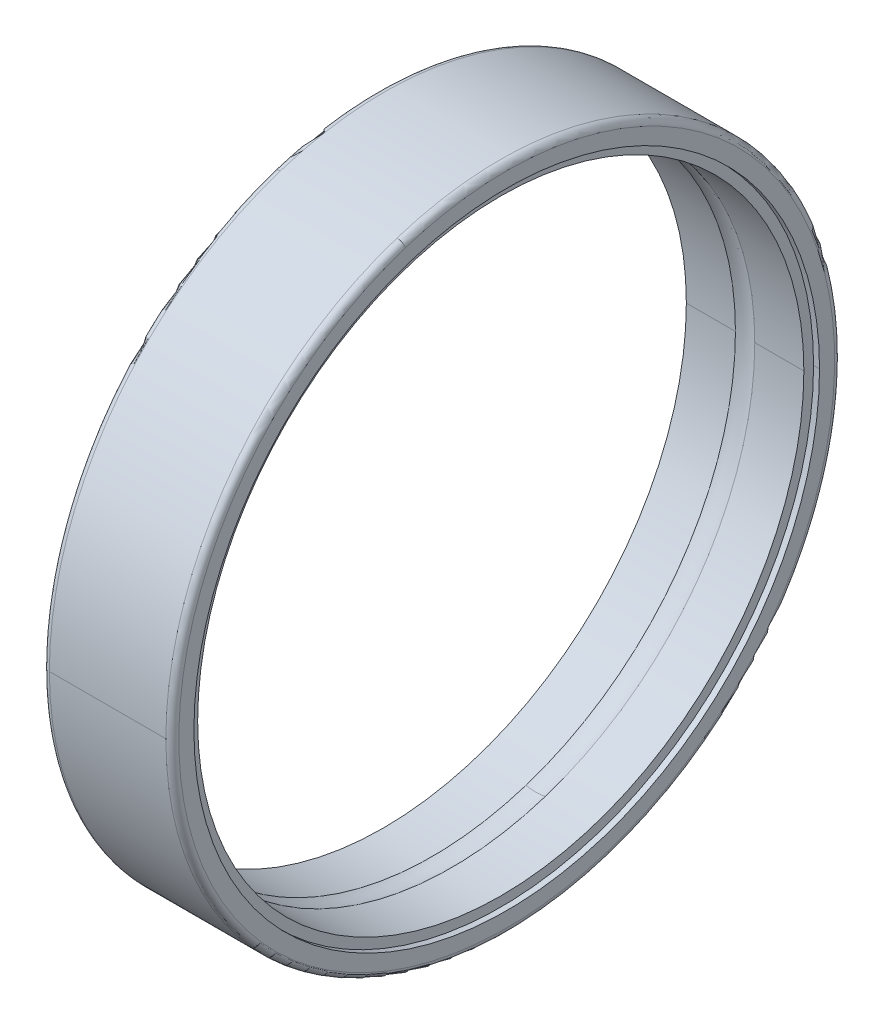
ISO-10303-21;
HEADER;
FILE_DESCRIPTION(('STEP AP214'),'2;1');
FILE_NAME('part.step','',(''),(''),'','','');
FILE_SCHEMA(('AUTOMOTIVE_DESIGN { 1 0 10303 214 1 1 1 1 }'));
ENDSEC;
DATA;
#1=APPLICATION_CONTEXT('core data for automotive mechanical design processes');
#2=APPLICATION_PROTOCOL_DEFINITION('international standard','automotive_design',2000,#1);
#3=PRODUCT_CONTEXT('',#1,'mechanical');
#4=PRODUCT('Part','Part','',(#3));
#5=PRODUCT_RELATED_PRODUCT_CATEGORY('part','',(#4));
#6=PRODUCT_DEFINITION_FORMATION('','',#4);
#7=PRODUCT_DEFINITION_CONTEXT('part definition',#1,'design');
#8=PRODUCT_DEFINITION('design','',#6,#7);
#9=PRODUCT_DEFINITION_SHAPE('','',#8);
#10=(LENGTH_UNIT() NAMED_UNIT(*) SI_UNIT(.MILLI.,.METRE.));
#11=(NAMED_UNIT(*) PLANE_ANGLE_UNIT() SI_UNIT($,.RADIAN.));
#12=(NAMED_UNIT(*) SI_UNIT($,.STERADIAN.) SOLID_ANGLE_UNIT());
#13=UNCERTAINTY_MEASURE_WITH_UNIT(LENGTH_MEASURE(1.E-05),#10,'distance_accuracy_value','');
#14=(GEOMETRIC_REPRESENTATION_CONTEXT(3) GLOBAL_UNCERTAINTY_ASSIGNED_CONTEXT((#13)) GLOBAL_UNIT_ASSIGNED_CONTEXT((#10,
#11,#12)) REPRESENTATION_CONTEXT('',''));
#15=CARTESIAN_POINT('',(0.,0.,0.));
#16=DIRECTION('',(0.,0.,1.));
#17=DIRECTION('',(1.,0.,0.));
#18=AXIS2_PLACEMENT_3D('',#15,#16,#17);
#19=CARTESIAN_POINT('',(0.,30.4,0.));
#20=DIRECTION('',(-1.,0.,0.));
#21=DIRECTION('',(0.,0.,1.));
#22=AXIS2_PLACEMENT_3D('',#19,#20,#21);
#23=PLANE('',#22);
#24=CARTESIAN_POINT('',(0.,0.,0.));
#25=DIRECTION('',(1.,0.,0.));
#26=DIRECTION('',(0.,0.,-1.));
#27=AXIS2_PLACEMENT_3D('',#24,#25,#26);
#28=CIRCLE('',#27,29.);
#29=CARTESIAN_POINT('',(0.,0.,-29.));
#30=VERTEX_POINT('',#29);
#31=CARTESIAN_POINT('',(0.,0.,29.));
#32=VERTEX_POINT('',#31);
#33=EDGE_CURVE('E11',#30,#32,#28,.T.);
#34=ORIENTED_EDGE('',*,*,#33,.T.);
#35=CARTESIAN_POINT('',(0.,0.,0.));
#36=DIRECTION('',(1.,0.,0.));
#37=DIRECTION('',(0.,0.,-1.));
#38=AXIS2_PLACEMENT_3D('',#35,#36,#37);
#39=CIRCLE('',#38,29.);
#40=EDGE_CURVE('E26',#32,#30,#39,.T.);
#41=ORIENTED_EDGE('',*,*,#40,.T.);
#42=EDGE_LOOP('',(#34,#41));
#43=FACE_BOUND('',#42,.T.);
#44=CARTESIAN_POINT('',(0.,28.9121180953726,9.39411662899848));
#45=CARTESIAN_POINT('',(0.,28.758417101322,9.86719379340273));
#46=CARTESIAN_POINT('',(0.,28.5930857030699,10.3364910663733));
#47=CARTESIAN_POINT('',(0.,28.2396037520902,11.2664117314761));
#48=CARTESIAN_POINT('',(0.,28.0514531993626,11.7270351236082));
#49=CARTESIAN_POINT('',(0.,27.6527745933593,12.6384939290629));
#50=CARTESIAN_POINT('',(0.,27.4422465400836,13.0893293423854));
#51=CARTESIAN_POINT('',(0.,26.9993232263331,13.9801272714513));
#52=CARTESIAN_POINT('',(0.,26.7669279658583,14.4200897871947));
#53=CARTESIAN_POINT('',(0.,26.2808292641677,15.2880816958203));
#54=CARTESIAN_POINT('',(0.,26.0271258229518,15.7161110887026));
#55=CARTESIAN_POINT('',(0.,25.4990221770816,16.5592056762597));
#56=CARTESIAN_POINT('',(0.,25.2246219724273,16.9742708709345));
#57=CARTESIAN_POINT('',(0.,24.6557857939238,17.7904371109044));
#58=CARTESIAN_POINT('',(0.,24.3613498200745,18.1915381561996));
#59=CARTESIAN_POINT('',(0.,23.7531514412775,18.978809815959));
#60=CARTESIAN_POINT('',(0.,23.4393890363297,19.3649804304233));
#61=CARTESIAN_POINT('',(0.,22.793293672152,20.121460908052));
#62=CARTESIAN_POINT('',(0.,22.4609607129221,20.4917707712164));
#63=CARTESIAN_POINT('',(0.,21.7785248605399,21.2156376377875));
#64=CARTESIAN_POINT('',(0.,21.4284219673876,21.5691946411942));
#65=CARTESIAN_POINT('',(0.,20.7112896753869,22.2587040383434));
#66=CARTESIAN_POINT('',(0.,20.3442602765386,22.5946564320859));
#67=CARTESIAN_POINT('',(0.,19.5941591791982,23.2481472711958));
#68=CARTESIAN_POINT('',(0.,19.2110874807063,23.5656857165632));
#69=CARTESIAN_POINT('',(0.,18.4298246373315,24.1815836809862));
#70=CARTESIAN_POINT('',(0.,18.0316334924486,24.479943200042));
#71=CARTESIAN_POINT('',(0.,17.2210910336433,25.0567645376295));
#72=CARTESIAN_POINT('',(0.,16.8087397197209,25.3352263561613));
#73=CARTESIAN_POINT('',(0.,15.9708703132678,25.871581453789));
#74=CARTESIAN_POINT('',(0.,15.5453522207372,26.129474732885));
#75=CARTESIAN_POINT('',(0.,14.6821743674241,26.6240714641433));
#76=CARTESIAN_POINT('',(0.,14.2445146066416,26.8607749163056));
#77=CARTESIAN_POINT('',(0.,13.3581077775228,27.3124217543473));
#78=CARTESIAN_POINT('',(0.,12.9093607091865,27.5273651402267));
#79=CARTESIAN_POINT('',(0.,12.0018603359533,27.9349740282594));
#80=CARTESIAN_POINT('',(0.,11.5431070310565,28.1276395304126));
#81=CARTESIAN_POINT('',(0.,10.6166993615957,28.4902285029227));
#82=CARTESIAN_POINT('',(0.,10.1490449970319,28.6601519732795));
#83=CARTESIAN_POINT('',(0.,9.20596182856304,28.9768475216732));
#84=CARTESIAN_POINT('',(0.,8.73053302465808,29.12361959971));
#85=CARTESIAN_POINT('',(0.,7.77304632713832,29.3936587766718));
#86=CARTESIAN_POINT('',(0.,7.29098843352352,29.5169258755969));
#87=CARTESIAN_POINT('',(0.,6.32140487627308,29.7396581330971));
#88=CARTESIAN_POINT('',(0.,5.83387921263743,29.8391232916722));
#89=CARTESIAN_POINT('',(0.,4.85453460737121,30.0140120481933));
#90=CARTESIAN_POINT('',(0.,4.36271566574063,30.0894356461393));
#91=CARTESIAN_POINT('',(0.,3.37596933939318,30.2160595793484));
#92=CARTESIAN_POINT('',(0.,2.88104195467631,30.2672599146115));
#93=CARTESIAN_POINT('',(0.,1.88927106557656,30.3453139763627));
#94=CARTESIAN_POINT('',(0.,1.39242756119369,30.3721677028506));
#95=CARTESIAN_POINT('',(0.,0.398021372282361,30.4014638540723));
#96=CARTESIAN_POINT('',(0.,-0.0995413122460932,30.4039062788059));
#97=CARTESIAN_POINT('',(0.,-1.09418718936021,30.3843739425037));
#98=CARTESIAN_POINT('',(0.,-1.59127038194588,30.3623991814678));
#99=CARTESIAN_POINT('',(0.,-2.58375975822414,30.2940854127507));
#100=CARTESIAN_POINT('',(0.,-3.07916594191674,30.2477464050695));
#101=CARTESIAN_POINT('',(0.,-4.06710782351989,30.13081577779));
#102=CARTESIAN_POINT('',(0.,-4.55964352143044,30.0602241581917));
#103=CARTESIAN_POINT('',(0.,-5.5406578698322,29.8949583684728));
#104=CARTESIAN_POINT('',(0.,-6.02913652032341,29.8002841983522));
#105=CARTESIAN_POINT('',(0.,-7.00085998603178,29.5870813859569));
#106=CARTESIAN_POINT('',(0.,-7.48410480124894,29.4685527436822));
#107=CARTESIAN_POINT('',(0.,-8.44419641732209,29.2079265328599));
#108=CARTESIAN_POINT('',(0.,-8.92104321817808,29.0658289643123));
#109=CARTESIAN_POINT('',(0.,-9.86719003981881,28.758407226433));
#110=CARTESIAN_POINT('',(0.,-10.3364900606036,28.5930830571014));
#111=CARTESIAN_POINT('',(0.,-11.2664127372458,28.2396063980587));
#112=CARTESIAN_POINT('',(0.,-11.7270353931034,28.0514539083477));
#113=CARTESIAN_POINT('',(0.,-12.6384936595676,27.6527738843741));
#114=CARTESIAN_POINT('',(0.,-13.0893292701743,27.4422463501116));
#115=CARTESIAN_POINT('',(0.,-13.9801273436622,26.9993234163051));
#116=CARTESIAN_POINT('',(0.,-14.4200898065435,26.7669280167612));
#117=CARTESIAN_POINT('',(0.,-15.2880816764714,26.2808292132648));
#118=CARTESIAN_POINT('',(0.,-15.7161110835181,26.0271258093124));
#119=CARTESIAN_POINT('',(0.,-16.5592056814442,25.499022190721));
#120=CARTESIAN_POINT('',(0.,-16.9742708723237,25.224621976082));
#121=CARTESIAN_POINT('',(0.,-17.7904371095152,24.6557857902692));
#122=CARTESIAN_POINT('',(0.,-18.1915381558273,24.3613498190953));
#123=CARTESIAN_POINT('',(0.,-18.9788098163312,23.7531514422568));
#124=CARTESIAN_POINT('',(0.,-19.364980430523,23.4393890365922));
#125=CARTESIAN_POINT('',(0.,-20.1214609079522,22.7932936718897));
#126=CARTESIAN_POINT('',(0.,-20.4917707711896,22.4609607128519));
#127=CARTESIAN_POINT('',(0.,-21.2156376378142,21.7785248606103));
#128=CARTESIAN_POINT('',(0.,-21.5691946412013,21.4284219674065));
#129=CARTESIAN_POINT('',(0.,-22.2587040383362,20.7112896753681));
#130=CARTESIAN_POINT('',(0.,-22.594656432084,20.3442602765335));
#131=CARTESIAN_POINT('',(0.,-23.2481472711977,19.5941591792033));
#132=CARTESIAN_POINT('',(0.,-23.5656857165637,19.2110874807077));
#133=CARTESIAN_POINT('',(0.,-24.1815836809857,18.4298246373302));
#134=CARTESIAN_POINT('',(0.,-24.4799432000418,18.0316334924483));
#135=CARTESIAN_POINT('',(0.,-25.0567645376296,17.2210910336437));
#136=CARTESIAN_POINT('',(0.,-25.3352263561613,16.808739719721));
#137=CARTESIAN_POINT('',(0.,-25.871581453789,15.9708703132678));
#138=CARTESIAN_POINT('',(0.,-26.129474732885,15.5453522207372));
#139=CARTESIAN_POINT('',(0.,-26.6240714641433,14.6821743674241));
#140=CARTESIAN_POINT('',(0.,-26.8607749163056,14.2445146066416));
#141=CARTESIAN_POINT('',(0.,-27.3124217543472,13.3581077775228));
#142=CARTESIAN_POINT('',(0.,-27.5273651402267,12.9093607091865));
#143=CARTESIAN_POINT('',(0.,-27.9349740282594,12.0018603359533));
#144=CARTESIAN_POINT('',(0.,-28.1276395304127,11.5431070310564));
#145=CARTESIAN_POINT('',(0.,-28.4902285029226,10.6166993615958));
#146=CARTESIAN_POINT('',(0.,-28.6601519732791,10.149044997032));
#147=CARTESIAN_POINT('',(0.,-28.9768475216735,9.20596182856297));
#148=CARTESIAN_POINT('',(0.,-29.1236195997113,8.73053302465773));
#149=CARTESIAN_POINT('',(0.,-29.3936587766704,7.77304632713873));
#150=CARTESIAN_POINT('',(0.,-29.5169258755917,7.29098843352497));
#151=CARTESIAN_POINT('',(0.,-29.7396581331023,6.3214048762717));
#152=CARTESIAN_POINT('',(0.,-29.8391232916916,5.83387921263219));
#153=CARTESIAN_POINT('',(0.,-30.0140120481738,4.85453460737652));
#154=CARTESIAN_POINT('',(0.,-30.0894356460667,4.36271566576036));
#155=CARTESIAN_POINT('',(0.,-30.216059579421,3.37596933937349));
#156=CARTESIAN_POINT('',(0.,-30.2672599148824,2.88104195460278));
#157=CARTESIAN_POINT('',(0.,-30.3453139760917,1.88927106565012));
#158=CARTESIAN_POINT('',(0.,-30.3721677018396,1.39242756146817));
#159=CARTESIAN_POINT('',(0.,-30.4014638550833,0.398021372007936));
#160=CARTESIAN_POINT('',(0.,-30.4039062825791,-0.0995413132703424));
#161=CARTESIAN_POINT('',(0.,-30.3843739387304,-1.09418718833591));
#162=CARTESIAN_POINT('',(0.,-30.3623991673859,-1.59127037812319));
#163=CARTESIAN_POINT('',(0.,-30.2940854268326,-2.58375976204678));
#164=CARTESIAN_POINT('',(0.,-30.2477464576238,-3.07916595618309));
#165=CARTESIAN_POINT('',(0.,-30.1308157252358,-4.06710780925351));
#166=CARTESIAN_POINT('',(0.,-30.0602239620566,-4.55964346818763));
#167=CARTESIAN_POINT('',(0.,-29.894958564608,-5.54065792307498));
#168=CARTESIAN_POINT('',(0.,-29.8002849303385,-6.0291367190282));
#169=CARTESIAN_POINT('',(0.,-29.5870806539705,-7.00085978732694));
#170=CARTESIAN_POINT('',(0.,-29.468550011872,-7.48410405967246));
#171=CARTESIAN_POINT('',(0.,-29.20792926467,-8.44419715889851));
#172=CARTESIAN_POINT('',(0.,-29.0658391595666,-8.92104598577903));
#173=CARTESIAN_POINT('',(0.,-28.9121180953727,-9.39411662899842));
#174=B_SPLINE_CURVE_WITH_KNOTS('',3,(#44,#45,#46,#47,#48,#49,#50,#51,#52,#53,#54,#55,#56,#57,
#58,#59,#60,#61,#62,#63,#64,#65,#66,#67,#68,#69,#70,#71,#72,#73,#74,#75,#76,#77,#78,#79,#80,#81,
#82,#83,#84,#85,#86,#87,#88,#89,#90,#91,#92,#93,#94,#95,#96,#97,#98,#99,#100,#101,#102,#103,
#104,#105,#106,#107,#108,#109,#110,#111,#112,#113,#114,#115,#116,#117,#118,#119,#120,#121,#122,
#123,#124,#125,#126,#127,#128,#129,#130,#131,#132,#133,#134,#135,#136,#137,#138,#139,#140,#141,
#142,#143,#144,#145,#146,#147,#148,#149,#150,#151,#152,#153,#154,#155,#156,#157,#158,#159,#160,
#161,#162,#163,#164,#165,#166,#167,#168,#169,#170,#171,#172,#173),.UNSPECIFIED.,.F.,.F.,(4,2,2,
2,2,2,2,2,2,2,2,2,2,2,2,2,2,2,2,2,2,2,2,2,2,2,2,2,2,2,2,2,2,2,2,2,2,2,2,2,2,2,2,2,2,2,2,2,2,2,2,
2,2,2,2,2,2,2,2,2,2,2,2,2,4),(0.,1.49210669419306,2.98421338838613,4.4763200825792,
5.96842677677227,7.46053347096533,8.9526401651584,10.4447468593515,11.9368535535445,
13.4289602477376,14.9210669419307,16.4131736361237,17.9052803303168,19.3973870245099,
20.8894937187029,22.381600412896,23.8737071070891,25.3658138012821,26.8579204954752,
28.3500271896683,29.8421338838613,31.3342405780544,32.8263472722475,34.3184539664405,
35.8105606606336,37.3026673548267,38.7947740490197,40.2868807432128,41.7789874374059,
43.2710941315989,44.763200825792,46.2553075199851,47.7474142141781,49.2395209083712,
50.7316276025643,52.2237342967573,53.7158409909504,55.2079476851435,56.7000543793365,
58.1921610735296,59.6842677677227,61.1763744619157,62.6684811561088,64.1605878503019,
65.6526945444949,67.144801238688,68.636907932881,70.1290146270741,71.6211213212672,
73.1132280154603,74.6053347096533,76.0974414038464,77.5895480980394,79.0816547922325,
80.5737614864256,82.0658681806187,83.5579748748117,85.0500815690048,86.5421882631978,
88.0342949573909,89.526401651584,91.018508345777,92.5106150399701,94.0027217341631,
95.4948284283562),.UNSPECIFIED.);
#175=CARTESIAN_POINT('',(0.,28.9121180953727,9.3941166289984));
#176=VERTEX_POINT('',#175);
#177=CARTESIAN_POINT('',(0.,-28.9121180953727,-9.3941166289984));
#178=VERTEX_POINT('',#177);
#179=EDGE_CURVE('E318',#176,#178,#174,.T.);
#180=ORIENTED_EDGE('',*,*,#179,.F.);
#181=CARTESIAN_POINT('',(0.,-28.9121180953726,-9.39411662899847));
#182=CARTESIAN_POINT('',(0.,-28.758417101322,-9.86719379340273));
#183=CARTESIAN_POINT('',(0.,-28.5930857030699,-10.3364910663733));
#184=CARTESIAN_POINT('',(0.,-28.2396037520902,-11.2664117314761));
#185=CARTESIAN_POINT('',(0.,-28.0514531993626,-11.7270351236082));
#186=CARTESIAN_POINT('',(0.,-27.6527745933593,-12.6384939290629));
#187=CARTESIAN_POINT('',(0.,-27.4422465400836,-13.0893293423853));
#188=CARTESIAN_POINT('',(0.,-26.9993232263331,-13.9801272714512));
#189=CARTESIAN_POINT('',(0.,-26.7669279658583,-14.4200897871946));
#190=CARTESIAN_POINT('',(0.,-26.2808292641677,-15.2880816958203));
#191=CARTESIAN_POINT('',(0.,-26.0271258229518,-15.7161110887026));
#192=CARTESIAN_POINT('',(0.,-25.4990221770816,-16.5592056762597));
#193=CARTESIAN_POINT('',(0.,-25.2246219724273,-16.9742708709345));
#194=CARTESIAN_POINT('',(0.,-24.6557857939238,-17.7904371109044));
#195=CARTESIAN_POINT('',(0.,-24.3613498200746,-18.1915381561996));
#196=CARTESIAN_POINT('',(0.,-23.7531514412775,-18.978809815959));
#197=CARTESIAN_POINT('',(0.,-23.4393890363298,-19.3649804304233));
#198=CARTESIAN_POINT('',(0.,-22.7932936721521,-20.121460908052));
#199=CARTESIAN_POINT('',(0.,-22.4609607129221,-20.4917707712164));
#200=CARTESIAN_POINT('',(0.,-21.7785248605399,-21.2156376377874));
#201=CARTESIAN_POINT('',(0.,-21.4284219673876,-21.5691946411941));
#202=CARTESIAN_POINT('',(0.,-20.711289675387,-22.2587040383434));
#203=CARTESIAN_POINT('',(0.,-20.3442602765386,-22.5946564320859));
#204=CARTESIAN_POINT('',(0.,-19.5941591791983,-23.2481472711958));
#205=CARTESIAN_POINT('',(0.,-19.2110874807063,-23.5656857165631));
#206=CARTESIAN_POINT('',(0.,-18.4298246373315,-24.1815836809862));
#207=CARTESIAN_POINT('',(0.,-18.0316334924486,-24.4799432000419));
#208=CARTESIAN_POINT('',(0.,-17.2210910336433,-25.0567645376295));
#209=CARTESIAN_POINT('',(0.,-16.8087397197209,-25.3352263561612));
#210=CARTESIAN_POINT('',(0.,-15.9708703132679,-25.871581453789));
#211=CARTESIAN_POINT('',(0.,-15.5453522207372,-26.129474732885));
#212=CARTESIAN_POINT('',(0.,-14.6821743674241,-26.6240714641433));
#213=CARTESIAN_POINT('',(0.,-14.2445146066416,-26.8607749163055));
#214=CARTESIAN_POINT('',(0.,-13.3581077775228,-27.3124217543473));
#215=CARTESIAN_POINT('',(0.,-12.9093607091865,-27.5273651402267));
#216=CARTESIAN_POINT('',(0.,-12.0018603359533,-27.9349740282594));
#217=CARTESIAN_POINT('',(0.,-11.5431070310565,-28.1276395304126));
#218=CARTESIAN_POINT('',(0.,-10.6166993615958,-28.4902285029227));
#219=CARTESIAN_POINT('',(0.,-10.1490449970319,-28.6601519732795));
#220=CARTESIAN_POINT('',(0.,-9.20596182856307,-28.9768475216731));
#221=CARTESIAN_POINT('',(0.,-8.73053302465811,-29.1236195997099));
#222=CARTESIAN_POINT('',(0.,-7.77304632713835,-29.3936587766718));
#223=CARTESIAN_POINT('',(0.,-7.29098843352355,-29.5169258755969));
#224=CARTESIAN_POINT('',(0.,-6.32140487627311,-29.7396581330971));
#225=CARTESIAN_POINT('',(0.,-5.83387921263747,-29.8391232916722));
#226=CARTESIAN_POINT('',(0.,-4.85453460737125,-30.0140120481933));
#227=CARTESIAN_POINT('',(0.,-4.36271566574068,-30.0894356461393));
#228=CARTESIAN_POINT('',(0.,-3.37596933939323,-30.2160595793484));
#229=CARTESIAN_POINT('',(0.,-2.88104195467635,-30.2672599146115));
#230=CARTESIAN_POINT('',(0.,-1.8892710655766,-30.3453139763627));
#231=CARTESIAN_POINT('',(0.,-1.39242756119372,-30.3721677028506));
#232=CARTESIAN_POINT('',(0.,-0.398021372282396,-30.4014638540723));
#233=CARTESIAN_POINT('',(0.,0.0995413122460538,-30.4039062788059));
#234=CARTESIAN_POINT('',(0.,1.09418718936017,-30.3843739425037));
#235=CARTESIAN_POINT('',(0.,1.59127038194584,-30.3623991814678));
#236=CARTESIAN_POINT('',(0.,2.5837597582241,-30.2940854127507));
#237=CARTESIAN_POINT('',(0.,3.07916594191669,-30.2477464050695));
#238=CARTESIAN_POINT('',(0.,4.06710782351983,-30.13081577779));
#239=CARTESIAN_POINT('',(0.,4.55964352143039,-30.0602241581917));
#240=CARTESIAN_POINT('',(0.,5.54065786983215,-29.8949583684728));
#241=CARTESIAN_POINT('',(0.,6.02913652032336,-29.8002841983522));
#242=CARTESIAN_POINT('',(0.,7.00085998603172,-29.5870813859569));
#243=CARTESIAN_POINT('',(0.,7.48410480124888,-29.4685527436822));
#244=CARTESIAN_POINT('',(0.,8.44419641732203,-29.2079265328599));
#245=CARTESIAN_POINT('',(0.,8.92104321817803,-29.0658289643123));
#246=CARTESIAN_POINT('',(0.,9.86719003981876,-28.7584072264331));
#247=CARTESIAN_POINT('',(0.,10.3364900606035,-28.5930830571014));
#248=CARTESIAN_POINT('',(0.,11.2664127372458,-28.2396063980588));
#249=CARTESIAN_POINT('',(0.,11.7270353931034,-28.0514539083477));
#250=CARTESIAN_POINT('',(0.,12.6384936595676,-27.6527738843742));
#251=CARTESIAN_POINT('',(0.,13.0893292701743,-27.4422463501116));
#252=CARTESIAN_POINT('',(0.,13.9801273436622,-26.9993234163052));
#253=CARTESIAN_POINT('',(0.,14.4200898065435,-26.7669280167612));
#254=CARTESIAN_POINT('',(0.,15.2880816764714,-26.2808292132649));
#255=CARTESIAN_POINT('',(0.,15.716111083518,-26.0271258093124));
#256=CARTESIAN_POINT('',(0.,16.5592056814441,-25.499022190721));
#257=CARTESIAN_POINT('',(0.,16.9742708723236,-25.2246219760821));
#258=CARTESIAN_POINT('',(0.,17.7904371095152,-24.6557857902692));
#259=CARTESIAN_POINT('',(0.,18.1915381558272,-24.3613498190953));
#260=CARTESIAN_POINT('',(0.,18.9788098163311,-23.7531514422568));
#261=CARTESIAN_POINT('',(0.,19.364980430523,-23.4393890365922));
#262=CARTESIAN_POINT('',(0.,20.1214609079522,-22.7932936718897));
#263=CARTESIAN_POINT('',(0.,20.4917707711896,-22.4609607128519));
#264=CARTESIAN_POINT('',(0.,21.2156376378141,-21.7785248606103));
#265=CARTESIAN_POINT('',(0.,21.5691946412013,-21.4284219674065));
#266=CARTESIAN_POINT('',(0.,22.2587040383362,-20.7112896753682));
#267=CARTESIAN_POINT('',(0.,22.594656432084,-20.3442602765336));
#268=CARTESIAN_POINT('',(0.,23.2481472711977,-19.5941591792034));
#269=CARTESIAN_POINT('',(0.,23.5656857165636,-19.2110874807077));
#270=CARTESIAN_POINT('',(0.,24.1815836809856,-18.4298246373302));
#271=CARTESIAN_POINT('',(0.,24.4799432000418,-18.0316334924483));
#272=CARTESIAN_POINT('',(0.,25.0567645376296,-17.2210910336438));
#273=CARTESIAN_POINT('',(0.,25.3352263561612,-16.8087397197211));
#274=CARTESIAN_POINT('',(0.,25.8715814537889,-15.9708703132678));
#275=CARTESIAN_POINT('',(0.,26.129474732885,-15.5453522207373));
#276=CARTESIAN_POINT('',(0.,26.6240714641432,-14.6821743674242));
#277=CARTESIAN_POINT('',(0.,26.8607749163055,-14.2445146066417));
#278=CARTESIAN_POINT('',(0.,27.3124217543472,-13.3581077775229));
#279=CARTESIAN_POINT('',(0.,27.5273651402266,-12.9093607091866));
#280=CARTESIAN_POINT('',(0.,27.9349740282594,-12.0018603359534));
#281=CARTESIAN_POINT('',(0.,28.1276395304127,-11.5431070310565));
#282=CARTESIAN_POINT('',(0.,28.4902285029225,-10.6166993615959));
#283=CARTESIAN_POINT('',(0.,28.6601519732791,-10.1490449970321));
#284=CARTESIAN_POINT('',(0.,28.9768475216735,-9.20596182856305));
#285=CARTESIAN_POINT('',(0.,29.1236195997113,-8.73053302465781));
#286=CARTESIAN_POINT('',(0.,29.3936587766704,-7.77304632713881));
#287=CARTESIAN_POINT('',(0.,29.5169258755917,-7.29098843352505));
#288=CARTESIAN_POINT('',(0.,29.7396581331022,-6.32140487627178));
#289=CARTESIAN_POINT('',(0.,29.8391232916916,-5.83387921263227));
#290=CARTESIAN_POINT('',(0.,30.0140120481738,-4.85453460737662));
#291=CARTESIAN_POINT('',(0.,30.0894356460667,-4.36271566576046));
#292=CARTESIAN_POINT('',(0.,30.216059579421,-3.3759693393736));
#293=CARTESIAN_POINT('',(0.,30.2672599148824,-2.8810419546029));
#294=CARTESIAN_POINT('',(0.,30.3453139760917,-1.88927106565023));
#295=CARTESIAN_POINT('',(0.,30.3721677018396,-1.39242756146828));
#296=CARTESIAN_POINT('',(0.,30.4014638550833,-0.398021372008047));
#297=CARTESIAN_POINT('',(0.,30.4039062825791,0.0995413132702305));
#298=CARTESIAN_POINT('',(0.,30.3843739387304,1.09418718833579));
#299=CARTESIAN_POINT('',(0.,30.362399167386,1.59127037812308));
#300=CARTESIAN_POINT('',(0.,30.2940854268326,2.58375976204667));
#301=CARTESIAN_POINT('',(0.,30.2477464576238,3.07916595618298));
#302=CARTESIAN_POINT('',(0.,30.1308157252358,4.0671078092534));
#303=CARTESIAN_POINT('',(0.,30.0602239620566,4.55964346818752));
#304=CARTESIAN_POINT('',(0.,29.894958564608,5.54065792307487));
#305=CARTESIAN_POINT('',(0.,29.8002849303385,6.02913671902809));
#306=CARTESIAN_POINT('',(0.,29.5870806539706,7.00085978732684));
#307=CARTESIAN_POINT('',(0.,29.4685500118721,7.48410405967235));
#308=CARTESIAN_POINT('',(0.,29.2079292646701,8.4441971588984));
#309=CARTESIAN_POINT('',(0.,29.0658391595666,8.92104598577893));
#310=CARTESIAN_POINT('',(0.,28.9121180953727,9.39411662899832));
#311=B_SPLINE_CURVE_WITH_KNOTS('',3,(#181,#182,#183,#184,#185,#186,#187,#188,#189,#190,#191,
#192,#193,#194,#195,#196,#197,#198,#199,#200,#201,#202,#203,#204,#205,#206,#207,#208,#209,#210,
#211,#212,#213,#214,#215,#216,#217,#218,#219,#220,#221,#222,#223,#224,#225,#226,#227,#228,#229,
#230,#231,#232,#233,#234,#235,#236,#237,#238,#239,#240,#241,#242,#243,#244,#245,#246,#247,#248,
#249,#250,#251,#252,#253,#254,#255,#256,#257,#258,#259,#260,#261,#262,#263,#264,#265,#266,#267,
#268,#269,#270,#271,#272,#273,#274,#275,#276,#277,#278,#279,#280,#281,#282,#283,#284,#285,#286,
#287,#288,#289,#290,#291,#292,#293,#294,#295,#296,#297,#298,#299,#300,#301,#302,#303,#304,#305,
#306,#307,#308,#309,#310),.UNSPECIFIED.,.F.,.F.,(4,2,2,2,2,2,2,2,2,2,2,2,2,2,2,2,2,2,2,2,2,2,2,
2,2,2,2,2,2,2,2,2,2,2,2,2,2,2,2,2,2,2,2,2,2,2,2,2,2,2,2,2,2,2,2,2,2,2,2,2,2,2,2,2,4),(0.,
1.49210669419306,2.98421338838613,4.47632008257919,5.96842677677226,7.46053347096533,
8.95264016515839,10.4447468593514,11.9368535535445,13.4289602477376,14.9210669419307,
16.4131736361237,17.9052803303168,19.3973870245098,20.8894937187029,22.381600412896,
23.873707107089,25.3658138012821,26.8579204954752,28.3500271896682,29.8421338838613,
31.3342405780544,32.8263472722474,34.3184539664405,35.8105606606335,37.3026673548266,
38.7947740490197,40.2868807432127,41.7789874374058,43.2710941315989,44.763200825792,
46.255307519985,47.7474142141781,49.2395209083711,50.7316276025642,52.2237342967573,
53.7158409909503,55.2079476851434,56.7000543793365,58.1921610735295,59.6842677677226,
61.1763744619157,62.6684811561087,64.1605878503018,65.6526945444949,67.1448012386879,
68.636907932881,70.129014627074,71.6211213212671,73.1132280154602,74.6053347096533,
76.0974414038463,77.5895480980394,79.0816547922324,80.5737614864255,82.0658681806186,
83.5579748748116,85.0500815690047,86.5421882631977,88.0342949573908,89.5264016515839,
91.018508345777,92.51061503997,94.0027217341631,95.4948284283561),.UNSPECIFIED.);
#312=EDGE_CURVE('E420',#178,#176,#311,.T.);
#313=ORIENTED_EDGE('',*,*,#312,.F.);
#314=EDGE_LOOP('',(#180,#313));
#315=FACE_BOUND('',#314,.T.);
#316=ADVANCED_FACE('F17',(#43,#315),#23,.T.);
#317=CARTESIAN_POINT('',(0.599999999999872,0.,0.));
#318=DIRECTION('',(1.,0.,0.));
#319=DIRECTION('',(0.,-0.309016994374947,0.951056516295154));
#320=AXIS2_PLACEMENT_3D('',#317,#318,#319);
#321=TOROIDAL_SURFACE('',#320,30.4,0.599999999999872);
#322=CARTESIAN_POINT('',(0.599999999999872,-28.9121180953727,-9.3941166289984));
#323=DIRECTION('',(0.,0.309016994374946,-0.951056516295154));
#324=DIRECTION('',(2.13347857898846E-13,-0.951056516295154,-0.309016994374946));
#325=AXIS2_PLACEMENT_3D('',#322,#323,#324);
#326=CIRCLE('',#325,0.599999999999874);
#327=CARTESIAN_POINT('',(0.6,-29.4827520051496,-9.57952682562332));
#328=VERTEX_POINT('',#327);
#329=EDGE_CURVE('E383',#328,#178,#326,.T.);
#330=ORIENTED_EDGE('',*,*,#329,.T.);
#331=ORIENTED_EDGE('',*,*,#312,.T.);
#332=CARTESIAN_POINT('',(0.599999999999872,28.9121180953727,9.3941166289984));
#333=DIRECTION('',(0.,-0.309016994374946,0.951056516295154));
#334=DIRECTION('',(2.13347857898846E-13,0.951056516295154,0.309016994374946));
#335=AXIS2_PLACEMENT_3D('',#332,#333,#334);
#336=CIRCLE('',#335,0.599999999999874);
#337=CARTESIAN_POINT('',(0.6,29.4827520051496,9.57952682562333));
#338=VERTEX_POINT('',#337);
#339=EDGE_CURVE('E379',#338,#176,#336,.T.);
#340=ORIENTED_EDGE('',*,*,#339,.F.);
#341=CARTESIAN_POINT('',(0.6,0.,0.));
#342=DIRECTION('',(1.,0.,0.));
#343=DIRECTION('',(0.,0.,-1.));
#344=AXIS2_PLACEMENT_3D('',#341,#342,#343);
#345=CIRCLE('',#344,31.);
#346=CARTESIAN_POINT('',(0.6,0.,-31.));
#347=VERTEX_POINT('',#346);
#348=EDGE_CURVE('E374',#347,#338,#345,.T.);
#349=ORIENTED_EDGE('',*,*,#348,.F.);
#350=CARTESIAN_POINT('',(0.6,0.,0.));
#351=DIRECTION('',(1.,0.,0.));
#352=DIRECTION('',(0.,0.,-1.));
#353=AXIS2_PLACEMENT_3D('',#350,#351,#352);
#354=CIRCLE('',#353,31.);
#355=EDGE_CURVE('E369',#328,#347,#354,.T.);
#356=ORIENTED_EDGE('',*,*,#355,.F.);
#357=EDGE_LOOP('',(#330,#331,#340,#349,#356));
#358=FACE_BOUND('',#357,.T.);
#359=ADVANCED_FACE('F391',(#358),#321,.T.);
#360=CARTESIAN_POINT('',(12.,0.,0.));
#361=DIRECTION('',(1.,0.,0.));
#362=DIRECTION('',(0.,1.,0.));
#363=AXIS2_PLACEMENT_3D('',#360,#361,#362);
#364=CYLINDRICAL_SURFACE('',#363,31.);
#365=DIRECTION('',(1.,0.,0.));
#366=VECTOR('',#365,1.);
#367=CARTESIAN_POINT('',(0.6,0.,31.));
#368=LINE('',#367,#366);
#369=CARTESIAN_POINT('',(0.6,0.,31.));
#370=VERTEX_POINT('',#369);
#371=CARTESIAN_POINT('',(11.4,0.,31.));
#372=VERTEX_POINT('',#371);
#373=EDGE_CURVE('E364',#370,#372,#368,.T.);
#374=ORIENTED_EDGE('',*,*,#373,.F.);
#375=CARTESIAN_POINT('',(0.6,0.,0.));
#376=DIRECTION('',(1.,0.,0.));
#377=DIRECTION('',(0.,0.,-1.));
#378=AXIS2_PLACEMENT_3D('',#375,#376,#377);
#379=CIRCLE('',#378,31.);
#380=EDGE_CURVE('E359',#370,#328,#379,.T.);
#381=ORIENTED_EDGE('',*,*,#380,.T.);
#382=ORIENTED_EDGE('',*,*,#355,.T.);
#383=DIRECTION('',(1.,0.,0.));
#384=VECTOR('',#383,1.);
#385=CARTESIAN_POINT('',(0.6,0.,-31.));
#386=LINE('',#385,#384);
#387=CARTESIAN_POINT('',(11.4,0.,-31.));
#388=VERTEX_POINT('',#387);
#389=EDGE_CURVE('E355',#347,#388,#386,.T.);
#390=ORIENTED_EDGE('',*,*,#389,.T.);
#391=CARTESIAN_POINT('',(11.4,0.,0.));
#392=DIRECTION('',(1.,0.,0.));
#393=DIRECTION('',(0.,0.,-1.));
#394=AXIS2_PLACEMENT_3D('',#391,#392,#393);
#395=CIRCLE('',#394,31.);
#396=CARTESIAN_POINT('',(11.4,-29.4827520051495,-9.57952682562329));
#397=VERTEX_POINT('',#396);
#398=EDGE_CURVE('E350',#397,#388,#395,.T.);
#399=ORIENTED_EDGE('',*,*,#398,.F.);
#400=CARTESIAN_POINT('',(11.4,0.,0.));
#401=DIRECTION('',(1.,0.,0.));
#402=DIRECTION('',(0.,0.,-1.));
#403=AXIS2_PLACEMENT_3D('',#400,#401,#402);
#404=CIRCLE('',#403,31.);
#405=EDGE_CURVE('E345',#372,#397,#404,.T.);
#406=ORIENTED_EDGE('',*,*,#405,.F.);
#407=EDGE_LOOP('',(#374,#381,#382,#390,#399,#406));
#408=FACE_BOUND('',#407,.T.);
#409=ADVANCED_FACE('F400',(#408),#364,.T.);
#410=CARTESIAN_POINT('',(11.4000000000002,0.,0.));
#411=DIRECTION('',(1.,0.,0.));
#412=DIRECTION('',(0.,0.309016994374947,-0.951056516295154));
#413=AXIS2_PLACEMENT_3D('',#410,#411,#412);
#414=TOROIDAL_SURFACE('',#413,30.4,0.599999999999748);
#415=CARTESIAN_POINT('',(11.4000000000002,-28.9121180953727,-9.3941166289984));
#416=DIRECTION('',(0.,0.309016994374947,-0.951056516295154));
#417=DIRECTION('',(1.,0.,0.));
#418=AXIS2_PLACEMENT_3D('',#415,#416,#417);
#419=CIRCLE('',#418,0.599999999999747);
#420=CARTESIAN_POINT('',(12.,-28.9121180953727,-9.3941166289984));
#421=VERTEX_POINT('',#420);
#422=EDGE_CURVE('E341',#421,#397,#419,.T.);
#423=ORIENTED_EDGE('',*,*,#422,.F.);
#424=CARTESIAN_POINT('',(12.,0.,0.));
#425=DIRECTION('',(1.,0.,0.));
#426=DIRECTION('',(0.,0.,-1.));
#427=AXIS2_PLACEMENT_3D('',#424,#425,#426);
#428=CIRCLE('',#427,30.4);
#429=CARTESIAN_POINT('',(12.,28.9121180953727,9.3941166289984));
#430=VERTEX_POINT('',#429);
#431=EDGE_CURVE('E336',#430,#421,#428,.T.);
#432=ORIENTED_EDGE('',*,*,#431,.F.);
#433=CARTESIAN_POINT('',(11.4000000000002,28.9121180953727,9.3941166289984));
#434=DIRECTION('',(0.,-0.309016994374947,0.951056516295154));
#435=DIRECTION('',(1.,0.,0.));
#436=AXIS2_PLACEMENT_3D('',#433,#434,#435);
#437=CIRCLE('',#436,0.599999999999747);
#438=CARTESIAN_POINT('',(11.4,29.4827520051495,9.57952682562329));
#439=VERTEX_POINT('',#438);
#440=EDGE_CURVE('E332',#430,#439,#437,.T.);
#441=ORIENTED_EDGE('',*,*,#440,.T.);
#442=CARTESIAN_POINT('',(11.4,0.,0.));
#443=DIRECTION('',(1.,0.,0.));
#444=DIRECTION('',(0.,0.,-1.));
#445=AXIS2_PLACEMENT_3D('',#442,#443,#444);
#446=CIRCLE('',#445,31.);
#447=EDGE_CURVE('E327',#439,#372,#446,.T.);
#448=ORIENTED_EDGE('',*,*,#447,.T.);
#449=ORIENTED_EDGE('',*,*,#405,.T.);
#450=EDGE_LOOP('',(#423,#432,#441,#448,#449));
#451=FACE_BOUND('',#450,.T.);
#452=ADVANCED_FACE('F404',(#451),#414,.T.);
#453=CARTESIAN_POINT('',(12.,0.,0.));
#454=DIRECTION('',(1.,0.,0.));
#455=DIRECTION('',(0.,-1.,0.));
#456=AXIS2_PLACEMENT_3D('',#453,#454,#455);
#457=CYLINDRICAL_SURFACE('',#456,31.);
#458=ORIENTED_EDGE('',*,*,#373,.T.);
#459=ORIENTED_EDGE('',*,*,#447,.F.);
#460=CARTESIAN_POINT('',(11.4,0.,0.));
#461=DIRECTION('',(1.,0.,0.));
#462=DIRECTION('',(0.,0.,-1.));
#463=AXIS2_PLACEMENT_3D('',#460,#461,#462);
#464=CIRCLE('',#463,31.);
#465=EDGE_CURVE('E322',#388,#439,#464,.T.);
#466=ORIENTED_EDGE('',*,*,#465,.F.);
#467=ORIENTED_EDGE('',*,*,#389,.F.);
#468=ORIENTED_EDGE('',*,*,#348,.T.);
#469=CARTESIAN_POINT('',(0.6,0.,0.));
#470=DIRECTION('',(1.,0.,0.));
#471=DIRECTION('',(0.,0.,-1.));
#472=AXIS2_PLACEMENT_3D('',#469,#470,#471);
#473=CIRCLE('',#472,31.);
#474=EDGE_CURVE('E319',#338,#370,#473,.T.);
#475=ORIENTED_EDGE('',*,*,#474,.T.);
#476=EDGE_LOOP('',(#458,#459,#466,#467,#468,#475));
#477=FACE_BOUND('',#476,.T.);
#478=ADVANCED_FACE('F407',(#477),#457,.T.);
#479=CARTESIAN_POINT('',(0.599999999999872,0.,0.));
#480=DIRECTION('',(1.,0.,0.));
#481=DIRECTION('',(0.,0.309016994374947,-0.951056516295154));
#482=AXIS2_PLACEMENT_3D('',#479,#480,#481);
#483=TOROIDAL_SURFACE('',#482,30.4,0.599999999999872);
#484=ORIENTED_EDGE('',*,*,#329,.F.);
#485=ORIENTED_EDGE('',*,*,#380,.F.);
#486=ORIENTED_EDGE('',*,*,#474,.F.);
#487=ORIENTED_EDGE('',*,*,#339,.T.);
#488=ORIENTED_EDGE('',*,*,#179,.T.);
#489=EDGE_LOOP('',(#484,#485,#486,#487,#488));
#490=FACE_BOUND('',#489,.T.);
#491=ADVANCED_FACE('F289',(#490),#483,.T.);
#492=CARTESIAN_POINT('',(11.4000000000002,0.,0.));
#493=DIRECTION('',(1.,0.,0.));
#494=DIRECTION('',(0.,-0.309016994374947,0.951056516295154));
#495=AXIS2_PLACEMENT_3D('',#492,#493,#494);
#496=TOROIDAL_SURFACE('',#495,30.4,0.599999999999748);
#497=ORIENTED_EDGE('',*,*,#422,.T.);
#498=ORIENTED_EDGE('',*,*,#398,.T.);
#499=ORIENTED_EDGE('',*,*,#465,.T.);
#500=ORIENTED_EDGE('',*,*,#440,.F.);
#501=CARTESIAN_POINT('',(12.,-28.9121180953727,-9.3941166289984));
#502=CARTESIAN_POINT('',(12.,-27.4364337717686,-13.9355790258337));
#503=CARTESIAN_POINT('',(12.,-25.0694026664383,-18.1875669007202));
#504=CARTESIAN_POINT('',(12.,-21.8852609130421,-21.9155169745138));
#505=CARTESIAN_POINT('',(12.,-14.2268946277971,-27.921842204459));
#506=CARTESIAN_POINT('',(12.,-4.86619459969262,-30.5871919578738));
#507=CARTESIAN_POINT('',(12.,0.021395434675997,-30.9718619704532));
#508=CARTESIAN_POINT('',(12.,9.68378832465101,-29.8036359042684));
#509=CARTESIAN_POINT('',(12.,18.1874944320156,-25.0693386025007));
#510=CARTESIAN_POINT('',(12.,21.9155344709641,-21.8852806836441));
#511=CARTESIAN_POINT('',(12.,27.921846595688,-14.2268860095248));
#512=CARTESIAN_POINT('',(12.,30.5871656789654,-4.86619206563529));
#513=CARTESIAN_POINT('',(12.,30.9719563953033,0.0213744621000966));
#514=CARTESIAN_POINT('',(12.,30.3876690199449,4.85261088819014));
#515=CARTESIAN_POINT('',(12.,28.9121180953727,9.39411662899839));
#516=B_SPLINE_CURVE_WITH_KNOTS('',5,(#501,#502,#503,#504,#505,#506,#507,#508,#509,#510,#511,
#512,#513,#514,#515),.UNSPECIFIED.,.F.,.F.,(6,3,3,3,6),(0.,0.785398163397448,1.5707963267949,
2.35619449019234,3.14159265358979),.UNSPECIFIED.);
#517=EDGE_CURVE('E263',#421,#430,#516,.T.);
#518=ORIENTED_EDGE('',*,*,#517,.F.);
#519=EDGE_LOOP('',(#497,#498,#499,#500,#518));
#520=FACE_BOUND('',#519,.T.);
#521=ADVANCED_FACE('F283',(#520),#496,.T.);
#522=CARTESIAN_POINT('',(12.,29.,0.));
#523=DIRECTION('',(1.,0.,0.));
#524=DIRECTION('',(0.,0.,-1.));
#525=AXIS2_PLACEMENT_3D('',#522,#523,#524);
#526=PLANE('',#525);
#527=ORIENTED_EDGE('',*,*,#431,.T.);
#528=ORIENTED_EDGE('',*,*,#517,.T.);
#529=EDGE_LOOP('',(#527,#528));
#530=FACE_BOUND('',#529,.T.);
#531=CARTESIAN_POINT('',(12.,0.,0.));
#532=DIRECTION('',(1.,0.,0.));
#533=DIRECTION('',(0.,0.,-1.));
#534=AXIS2_PLACEMENT_3D('',#531,#532,#533);
#535=CIRCLE('',#534,29.);
#536=CARTESIAN_POINT('',(12.,0.,29.));
#537=VERTEX_POINT('',#536);
#538=CARTESIAN_POINT('',(12.,0.,-29.));
#539=VERTEX_POINT('',#538);
#540=EDGE_CURVE('E258',#537,#539,#535,.T.);
#541=ORIENTED_EDGE('',*,*,#540,.F.);
#542=CARTESIAN_POINT('',(12.,0.,0.));
#543=DIRECTION('',(1.,0.,0.));
#544=DIRECTION('',(0.,0.,-1.));
#545=AXIS2_PLACEMENT_3D('',#542,#543,#544);
#546=CIRCLE('',#545,29.);
#547=EDGE_CURVE('E253',#539,#537,#546,.T.);
#548=ORIENTED_EDGE('',*,*,#547,.F.);
#549=EDGE_LOOP('',(#541,#548));
#550=FACE_BOUND('',#549,.T.);
#551=ADVANCED_FACE('F272',(#530,#550),#526,.T.);
#552=CARTESIAN_POINT('',(12.,0.,0.));
#553=DIRECTION('',(1.,0.,0.));
#554=DIRECTION('',(0.,-1.,0.));
#555=AXIS2_PLACEMENT_3D('',#552,#553,#554);
#556=CYLINDRICAL_SURFACE('',#555,29.);
#557=DIRECTION('',(1.,0.,0.));
#558=VECTOR('',#557,1.);
#559=CARTESIAN_POINT('',(11.448,0.,29.));
#560=LINE('',#559,#558);
#561=CARTESIAN_POINT('',(11.448,0.,29.));
#562=VERTEX_POINT('',#561);
#563=EDGE_CURVE('E248',#562,#537,#560,.T.);
#564=ORIENTED_EDGE('',*,*,#563,.F.);
#565=CARTESIAN_POINT('',(11.448,0.,0.));
#566=DIRECTION('',(1.,0.,0.));
#567=DIRECTION('',(0.,0.,-1.));
#568=AXIS2_PLACEMENT_3D('',#565,#566,#567);
#569=CIRCLE('',#568,29.);
#570=CARTESIAN_POINT('',(11.448,0.,-29.));
#571=VERTEX_POINT('',#570);
#572=EDGE_CURVE('E243',#571,#562,#569,.T.);
#573=ORIENTED_EDGE('',*,*,#572,.F.);
#574=DIRECTION('',(1.,0.,0.));
#575=VECTOR('',#574,1.);
#576=CARTESIAN_POINT('',(11.448,0.,-29.));
#577=LINE('',#576,#575);
#578=EDGE_CURVE('E238',#571,#539,#577,.T.);
#579=ORIENTED_EDGE('',*,*,#578,.T.);
#580=ORIENTED_EDGE('',*,*,#547,.T.);
#581=EDGE_LOOP('',(#564,#573,#579,#580));
#582=FACE_BOUND('',#581,.T.);
#583=ADVANCED_FACE('F282',(#582),#556,.F.);
#584=CARTESIAN_POINT('',(12.,0.,0.));
#585=DIRECTION('',(1.,0.,0.));
#586=DIRECTION('',(0.,1.,0.));
#587=AXIS2_PLACEMENT_3D('',#584,#585,#586);
#588=CYLINDRICAL_SURFACE('',#587,29.);
#589=ORIENTED_EDGE('',*,*,#563,.T.);
#590=ORIENTED_EDGE('',*,*,#540,.T.);
#591=ORIENTED_EDGE('',*,*,#578,.F.);
#592=CARTESIAN_POINT('',(11.448,0.,0.));
#593=DIRECTION('',(1.,0.,0.));
#594=DIRECTION('',(0.,0.,-1.));
#595=AXIS2_PLACEMENT_3D('',#592,#593,#594);
#596=CIRCLE('',#595,29.);
#597=EDGE_CURVE('E233',#562,#571,#596,.T.);
#598=ORIENTED_EDGE('',*,*,#597,.F.);
#599=EDGE_LOOP('',(#589,#590,#591,#598));
#600=FACE_BOUND('',#599,.T.);
#601=ADVANCED_FACE('F451',(#600),#588,.F.);
#602=CARTESIAN_POINT('',(11.448,28.1,0.));
#603=DIRECTION('',(1.,0.,0.));
#604=DIRECTION('',(0.,0.,-1.));
#605=AXIS2_PLACEMENT_3D('',#602,#603,#604);
#606=PLANE('',#605);
#607=ORIENTED_EDGE('',*,*,#572,.T.);
#608=ORIENTED_EDGE('',*,*,#597,.T.);
#609=EDGE_LOOP('',(#607,#608));
#610=FACE_BOUND('',#609,.T.);
#611=CARTESIAN_POINT('',(11.448,0.,0.));
#612=DIRECTION('',(1.,0.,0.));
#613=DIRECTION('',(0.,0.,-1.));
#614=AXIS2_PLACEMENT_3D('',#611,#612,#613);
#615=CIRCLE('',#614,28.1);
#616=CARTESIAN_POINT('',(11.448,0.,28.1));
#617=VERTEX_POINT('',#616);
#618=CARTESIAN_POINT('',(11.448,0.,-28.1));
#619=VERTEX_POINT('',#618);
#620=EDGE_CURVE('E228',#617,#619,#615,.T.);
#621=ORIENTED_EDGE('',*,*,#620,.F.);
#622=CARTESIAN_POINT('',(11.448,0.,0.));
#623=DIRECTION('',(1.,0.,0.));
#624=DIRECTION('',(0.,0.,-1.));
#625=AXIS2_PLACEMENT_3D('',#622,#623,#624);
#626=CIRCLE('',#625,28.1);
#627=EDGE_CURVE('E223',#619,#617,#626,.T.);
#628=ORIENTED_EDGE('',*,*,#627,.F.);
#629=EDGE_LOOP('',(#621,#628));
#630=FACE_BOUND('',#629,.T.);
#631=ADVANCED_FACE('F454',(#610,#630),#606,.T.);
#632=CARTESIAN_POINT('',(12.,0.,0.));
#633=DIRECTION('',(1.,0.,0.));
#634=DIRECTION('',(0.,-1.,0.));
#635=AXIS2_PLACEMENT_3D('',#632,#633,#634);
#636=CYLINDRICAL_SURFACE('',#635,28.1);
#637=DIRECTION('',(1.,0.,0.));
#638=VECTOR('',#637,1.);
#639=CARTESIAN_POINT('',(6.8958236433584,0.,28.1));
#640=LINE('',#639,#638);
#641=CARTESIAN_POINT('',(6.8958236433584,0.,28.1));
#642=VERTEX_POINT('',#641);
#643=EDGE_CURVE('E218',#642,#617,#640,.T.);
#644=ORIENTED_EDGE('',*,*,#643,.F.);
#645=CARTESIAN_POINT('',(6.8958236433584,0.,0.));
#646=DIRECTION('',(1.,0.,0.));
#647=DIRECTION('',(0.,0.,-1.));
#648=AXIS2_PLACEMENT_3D('',#645,#646,#647);
#649=CIRCLE('',#648,28.1);
#650=CARTESIAN_POINT('',(6.89582364335833,26.7246881078936,8.68337754193596));
#651=VERTEX_POINT('',#650);
#652=EDGE_CURVE('E213',#651,#642,#649,.T.);
#653=ORIENTED_EDGE('',*,*,#652,.F.);
#654=CARTESIAN_POINT('',(6.8958236433584,0.,0.));
#655=DIRECTION('',(1.,0.,0.));
#656=DIRECTION('',(0.,0.,-1.));
#657=AXIS2_PLACEMENT_3D('',#654,#655,#656);
#658=CIRCLE('',#657,28.1);
#659=CARTESIAN_POINT('',(6.8958236433584,0.,-28.1));
#660=VERTEX_POINT('',#659);
#661=EDGE_CURVE('E208',#660,#651,#658,.T.);
#662=ORIENTED_EDGE('',*,*,#661,.F.);
#663=DIRECTION('',(1.,0.,0.));
#664=VECTOR('',#663,1.);
#665=CARTESIAN_POINT('',(6.8958236433584,0.,-28.1));
#666=LINE('',#665,#664);
#667=EDGE_CURVE('E203',#660,#619,#666,.T.);
#668=ORIENTED_EDGE('',*,*,#667,.T.);
#669=ORIENTED_EDGE('',*,*,#627,.T.);
#670=EDGE_LOOP('',(#644,#653,#662,#668,#669));
#671=FACE_BOUND('',#670,.T.);
#672=ADVANCED_FACE('F457',(#671),#636,.F.);
#673=CARTESIAN_POINT('',(12.,0.,0.));
#674=DIRECTION('',(1.,0.,0.));
#675=DIRECTION('',(0.,1.,0.));
#676=AXIS2_PLACEMENT_3D('',#673,#674,#675);
#677=CYLINDRICAL_SURFACE('',#676,28.1);
#678=ORIENTED_EDGE('',*,*,#643,.T.);
#679=ORIENTED_EDGE('',*,*,#620,.T.);
#680=ORIENTED_EDGE('',*,*,#667,.F.);
#681=CARTESIAN_POINT('',(6.8958236433584,0.,0.));
#682=DIRECTION('',(1.,0.,0.));
#683=DIRECTION('',(0.,0.,-1.));
#684=AXIS2_PLACEMENT_3D('',#681,#682,#683);
#685=CIRCLE('',#684,28.1);
#686=CARTESIAN_POINT('',(6.89582364335833,-26.7246881078936,-8.68337754193596));
#687=VERTEX_POINT('',#686);
#688=EDGE_CURVE('E198',#687,#660,#685,.T.);
#689=ORIENTED_EDGE('',*,*,#688,.F.);
#690=CARTESIAN_POINT('',(6.8958236433584,0.,0.));
#691=DIRECTION('',(1.,0.,0.));
#692=DIRECTION('',(0.,0.,-1.));
#693=AXIS2_PLACEMENT_3D('',#690,#691,#692);
#694=CIRCLE('',#693,28.1);
#695=EDGE_CURVE('E193',#642,#687,#694,.T.);
#696=ORIENTED_EDGE('',*,*,#695,.F.);
#697=EDGE_LOOP('',(#678,#679,#680,#689,#696));
#698=FACE_BOUND('',#697,.T.);
#699=ADVANCED_FACE('F462',(#698),#677,.F.);
#700=CARTESIAN_POINT('',(6.,0.,0.));
#701=DIRECTION('',(1.,0.,0.));
#702=DIRECTION('',(0.,0.309016994374947,-0.951056516295154));
#703=AXIS2_PLACEMENT_3D('',#700,#701,#702);
#704=TOROIDAL_SURFACE('',#703,25.5,2.74999999999978);
#705=CARTESIAN_POINT('',(6.,-24.2519411655264,-7.87993335656115));
#706=DIRECTION('',(0.,0.309016994374947,-0.951056516295154));
#707=DIRECTION('',(0.325754052130329,-0.899180706315423,-0.292161521954497));
#708=AXIS2_PLACEMENT_3D('',#705,#706,#707);
#709=CIRCLE('',#708,2.74999999999978);
#710=CARTESIAN_POINT('',(5.10417635664167,-26.7246881078936,-8.68337754193596));
#711=VERTEX_POINT('',#710);
#712=EDGE_CURVE('E189',#687,#711,#709,.T.);
#713=ORIENTED_EDGE('',*,*,#712,.T.);
#714=CARTESIAN_POINT('',(5.1041763566416,0.,0.));
#715=DIRECTION('',(1.,0.,0.));
#716=DIRECTION('',(0.,0.,-1.));
#717=AXIS2_PLACEMENT_3D('',#714,#715,#716);
#718=CIRCLE('',#717,28.1);
#719=CARTESIAN_POINT('',(5.1041763566416,0.,28.1));
#720=VERTEX_POINT('',#719);
#721=EDGE_CURVE('E184',#720,#711,#718,.T.);
#722=ORIENTED_EDGE('',*,*,#721,.F.);
#723=CARTESIAN_POINT('',(5.1041763566416,0.,0.));
#724=DIRECTION('',(1.,0.,0.));
#725=DIRECTION('',(0.,0.,-1.));
#726=AXIS2_PLACEMENT_3D('',#723,#724,#725);
#727=CIRCLE('',#726,28.1);
#728=CARTESIAN_POINT('',(5.10417635664167,26.7246881078936,8.68337754193596));
#729=VERTEX_POINT('',#728);
#730=EDGE_CURVE('E179',#729,#720,#727,.T.);
#731=ORIENTED_EDGE('',*,*,#730,.F.);
#732=CARTESIAN_POINT('',(6.,24.2519411655264,7.87993335656116));
#733=DIRECTION('',(0.,-0.309016994374947,0.951056516295154));
#734=DIRECTION('',(0.325754052130329,0.899180706315423,0.292161521954497));
#735=AXIS2_PLACEMENT_3D('',#732,#733,#734);
#736=CIRCLE('',#735,2.74999999999978);
#737=EDGE_CURVE('E174',#651,#729,#736,.T.);
#738=ORIENTED_EDGE('',*,*,#737,.F.);
#739=ORIENTED_EDGE('',*,*,#652,.T.);
#740=ORIENTED_EDGE('',*,*,#695,.T.);
#741=EDGE_LOOP('',(#713,#722,#731,#738,#739,#740));
#742=FACE_BOUND('',#741,.T.);
#743=ADVANCED_FACE('F469',(#742),#704,.F.);
#744=CARTESIAN_POINT('',(6.,0.,0.));
#745=DIRECTION('',(1.,0.,0.));
#746=DIRECTION('',(0.,-0.309016994374947,0.951056516295154));
#747=AXIS2_PLACEMENT_3D('',#744,#745,#746);
#748=TOROIDAL_SURFACE('',#747,25.5,2.74999999999978);
#749=ORIENTED_EDGE('',*,*,#712,.F.);
#750=ORIENTED_EDGE('',*,*,#688,.T.);
#751=ORIENTED_EDGE('',*,*,#661,.T.);
#752=ORIENTED_EDGE('',*,*,#737,.T.);
#753=CARTESIAN_POINT('',(5.1041763566416,0.,0.));
#754=DIRECTION('',(1.,0.,0.));
#755=DIRECTION('',(0.,0.,-1.));
#756=AXIS2_PLACEMENT_3D('',#753,#754,#755);
#757=CIRCLE('',#756,28.1);
#758=CARTESIAN_POINT('',(5.1041763566416,0.,-28.1));
#759=VERTEX_POINT('',#758);
#760=EDGE_CURVE('E169',#759,#729,#757,.T.);
#761=ORIENTED_EDGE('',*,*,#760,.F.);
#762=CARTESIAN_POINT('',(5.1041763566416,0.,0.));
#763=DIRECTION('',(1.,0.,0.));
#764=DIRECTION('',(0.,0.,-1.));
#765=AXIS2_PLACEMENT_3D('',#762,#763,#764);
#766=CIRCLE('',#765,28.1);
#767=EDGE_CURVE('E164',#711,#759,#766,.T.);
#768=ORIENTED_EDGE('',*,*,#767,.F.);
#769=EDGE_LOOP('',(#749,#750,#751,#752,#761,#768));
#770=FACE_BOUND('',#769,.T.);
#771=ADVANCED_FACE('F466',(#770),#748,.F.);
#772=CARTESIAN_POINT('',(12.,0.,0.));
#773=DIRECTION('',(1.,0.,0.));
#774=DIRECTION('',(0.,1.,0.));
#775=AXIS2_PLACEMENT_3D('',#772,#773,#774);
#776=CYLINDRICAL_SURFACE('',#775,28.1);
#777=DIRECTION('',(1.,0.,0.));
#778=VECTOR('',#777,1.);
#779=CARTESIAN_POINT('',(0.552,0.,28.1));
#780=LINE('',#779,#778);
#781=CARTESIAN_POINT('',(0.552,0.,28.1));
#782=VERTEX_POINT('',#781);
#783=EDGE_CURVE('E159',#782,#720,#780,.T.);
#784=ORIENTED_EDGE('',*,*,#783,.T.);
#785=ORIENTED_EDGE('',*,*,#721,.T.);
#786=ORIENTED_EDGE('',*,*,#767,.T.);
#787=DIRECTION('',(1.,0.,0.));
#788=VECTOR('',#787,1.);
#789=CARTESIAN_POINT('',(0.552,0.,-28.1));
#790=LINE('',#789,#788);
#791=CARTESIAN_POINT('',(0.552,0.,-28.1));
#792=VERTEX_POINT('',#791);
#793=EDGE_CURVE('E154',#792,#759,#790,.T.);
#794=ORIENTED_EDGE('',*,*,#793,.F.);
#795=CARTESIAN_POINT('',(0.552,0.,0.));
#796=DIRECTION('',(1.,0.,0.));
#797=DIRECTION('',(0.,0.,-1.));
#798=AXIS2_PLACEMENT_3D('',#795,#796,#797);
#799=CIRCLE('',#798,28.1);
#800=EDGE_CURVE('E143',#782,#792,#799,.T.);
#801=ORIENTED_EDGE('',*,*,#800,.F.);
#802=EDGE_LOOP('',(#784,#785,#786,#794,#801));
#803=FACE_BOUND('',#802,.T.);
#804=ADVANCED_FACE('F473',(#803),#776,.F.);
#805=CARTESIAN_POINT('',(0.552,29.,0.));
#806=DIRECTION('',(-1.,0.,0.));
#807=DIRECTION('',(0.,0.,1.));
#808=AXIS2_PLACEMENT_3D('',#805,#806,#807);
#809=PLANE('',#808);
#810=CARTESIAN_POINT('',(0.552,0.,0.));
#811=DIRECTION('',(1.,0.,0.));
#812=DIRECTION('',(0.,0.,-1.));
#813=AXIS2_PLACEMENT_3D('',#810,#811,#812);
#814=CIRCLE('',#813,28.1);
#815=EDGE_CURVE('E140',#792,#782,#814,.T.);
#816=ORIENTED_EDGE('',*,*,#815,.T.);
#817=ORIENTED_EDGE('',*,*,#800,.T.);
#818=EDGE_LOOP('',(#816,#817));
#819=FACE_BOUND('',#818,.T.);
#820=CARTESIAN_POINT('',(0.552,0.,0.));
#821=DIRECTION('',(1.,0.,0.));
#822=DIRECTION('',(0.,0.,-1.));
#823=AXIS2_PLACEMENT_3D('',#820,#821,#822);
#824=CIRCLE('',#823,29.);
#825=CARTESIAN_POINT('',(0.552,0.,29.));
#826=VERTEX_POINT('',#825);
#827=CARTESIAN_POINT('',(0.552,0.,-29.));
#828=VERTEX_POINT('',#827);
#829=EDGE_CURVE('E128',#826,#828,#824,.T.);
#830=ORIENTED_EDGE('',*,*,#829,.F.);
#831=CARTESIAN_POINT('',(0.552,0.,0.));
#832=DIRECTION('',(1.,0.,0.));
#833=DIRECTION('',(0.,0.,-1.));
#834=AXIS2_PLACEMENT_3D('',#831,#832,#833);
#835=CIRCLE('',#834,29.);
#836=EDGE_CURVE('E124',#828,#826,#835,.T.);
#837=ORIENTED_EDGE('',*,*,#836,.F.);
#838=EDGE_LOOP('',(#830,#837));
#839=FACE_BOUND('',#838,.T.);
#840=ADVANCED_FACE('F126',(#819,#839),#809,.T.);
#841=CARTESIAN_POINT('',(12.,0.,0.));
#842=DIRECTION('',(1.,0.,0.));
#843=DIRECTION('',(0.,-1.,0.));
#844=AXIS2_PLACEMENT_3D('',#841,#842,#843);
#845=CYLINDRICAL_SURFACE('',#844,29.);
#846=DIRECTION('',(1.,0.,0.));
#847=VECTOR('',#846,1.);
#848=CARTESIAN_POINT('',(0.,0.,29.));
#849=LINE('',#848,#847);
#850=EDGE_CURVE('E132',#32,#826,#849,.T.);
#851=ORIENTED_EDGE('',*,*,#850,.F.);
#852=ORIENTED_EDGE('',*,*,#33,.F.);
#853=DIRECTION('',(1.,0.,0.));
#854=VECTOR('',#853,1.);
#855=CARTESIAN_POINT('',(0.,0.,-29.));
#856=LINE('',#855,#854);
#857=EDGE_CURVE('E135',#30,#828,#856,.T.);
#858=ORIENTED_EDGE('',*,*,#857,.T.);
#859=ORIENTED_EDGE('',*,*,#836,.T.);
#860=EDGE_LOOP('',(#851,#852,#858,#859));
#861=FACE_BOUND('',#860,.T.);
#862=ADVANCED_FACE('F136',(#861),#845,.F.);
#863=CARTESIAN_POINT('',(12.,0.,0.));
#864=DIRECTION('',(1.,0.,0.));
#865=DIRECTION('',(0.,1.,0.));
#866=AXIS2_PLACEMENT_3D('',#863,#864,#865);
#867=CYLINDRICAL_SURFACE('',#866,29.);
#868=ORIENTED_EDGE('',*,*,#850,.T.);
#869=ORIENTED_EDGE('',*,*,#829,.T.);
#870=ORIENTED_EDGE('',*,*,#857,.F.);
#871=ORIENTED_EDGE('',*,*,#40,.F.);
#872=EDGE_LOOP('',(#868,#869,#870,#871));
#873=FACE_BOUND('',#872,.T.);
#874=ADVANCED_FACE('F139',(#873),#867,.F.);
#875=CARTESIAN_POINT('',(12.,0.,0.));
#876=DIRECTION('',(1.,0.,0.));
#877=DIRECTION('',(0.,-1.,0.));
#878=AXIS2_PLACEMENT_3D('',#875,#876,#877);
#879=CYLINDRICAL_SURFACE('',#878,28.1);
#880=ORIENTED_EDGE('',*,*,#783,.F.);
#881=ORIENTED_EDGE('',*,*,#815,.F.);
#882=ORIENTED_EDGE('',*,*,#793,.T.);
#883=ORIENTED_EDGE('',*,*,#760,.T.);
#884=ORIENTED_EDGE('',*,*,#730,.T.);
#885=EDGE_LOOP('',(#880,#881,#882,#883,#884));
#886=FACE_BOUND('',#885,.T.);
#887=ADVANCED_FACE('F476',(#886),#879,.F.);
#888=CLOSED_SHELL('',(#316,#359,#409,#452,#478,#491,#521,#551,#583,#601,#631,#672,#699,#743,
#771,#804,#840,#862,#874,#887));
#889=MANIFOLD_SOLID_BREP('B1',#888);
#890=ADVANCED_BREP_SHAPE_REPRESENTATION('',(#18,#889),#14);
#891=SHAPE_DEFINITION_REPRESENTATION(#9,#890);
ENDSEC;
END-ISO-10303-21;
